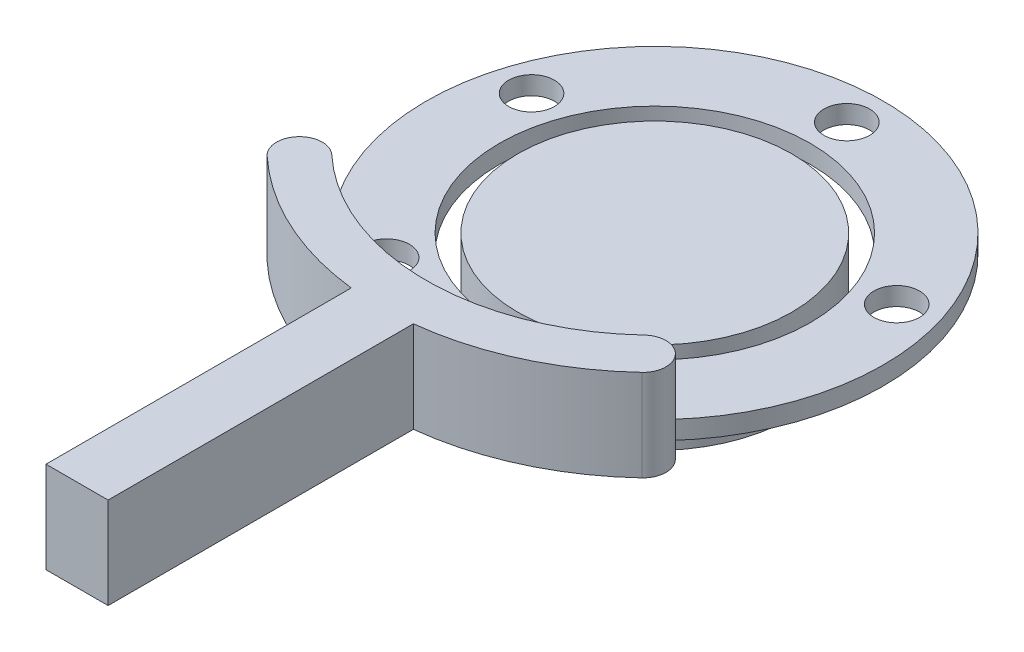
ISO-10303-21;
HEADER;
FILE_DESCRIPTION(('STEP AP214'),'2;1');
FILE_NAME('part.step','',(''),(''),'','','');
FILE_SCHEMA(('AUTOMOTIVE_DESIGN { 1 0 10303 214 1 1 1 1 }'));
ENDSEC;
DATA;
#1=APPLICATION_CONTEXT('core data for automotive mechanical design processes');
#2=APPLICATION_PROTOCOL_DEFINITION('international standard','automotive_design',2000,#1);
#3=PRODUCT_CONTEXT('',#1,'mechanical');
#4=PRODUCT('Part','Part','',(#3));
#5=PRODUCT_RELATED_PRODUCT_CATEGORY('part','',(#4));
#6=PRODUCT_DEFINITION_FORMATION('','',#4);
#7=PRODUCT_DEFINITION_CONTEXT('part definition',#1,'design');
#8=PRODUCT_DEFINITION('design','',#6,#7);
#9=PRODUCT_DEFINITION_SHAPE('','',#8);
#10=(LENGTH_UNIT() NAMED_UNIT(*) SI_UNIT(.MILLI.,.METRE.));
#11=(NAMED_UNIT(*) PLANE_ANGLE_UNIT() SI_UNIT($,.RADIAN.));
#12=(NAMED_UNIT(*) SI_UNIT($,.STERADIAN.) SOLID_ANGLE_UNIT());
#13=UNCERTAINTY_MEASURE_WITH_UNIT(LENGTH_MEASURE(1.E-05),#10,'distance_accuracy_value','');
#14=(GEOMETRIC_REPRESENTATION_CONTEXT(3) GLOBAL_UNCERTAINTY_ASSIGNED_CONTEXT((#13)) GLOBAL_UNIT_ASSIGNED_CONTEXT((#10,
#11,#12)) REPRESENTATION_CONTEXT('',''));
#15=CARTESIAN_POINT('',(0.,0.,0.));
#16=DIRECTION('',(0.,0.,1.));
#17=DIRECTION('',(1.,0.,0.));
#18=AXIS2_PLACEMENT_3D('',#15,#16,#17);
#19=CARTESIAN_POINT('',(0.,50.,0.));
#20=DIRECTION('',(0.,-1.,0.));
#21=DIRECTION('',(0.,0.,-1.));
#22=AXIS2_PLACEMENT_3D('',#19,#20,#21);
#23=CYLINDRICAL_SURFACE('',#22,125.);
#24=CARTESIAN_POINT('',(0.,10.,0.));
#25=DIRECTION('',(0.,1.,0.));
#26=DIRECTION('',(0.,0.,1.));
#27=AXIS2_PLACEMENT_3D('',#24,#25,#26);
#28=CIRCLE('',#27,125.);
#29=CARTESIAN_POINT('',(-85.4248979414119,10.,91.2556124942426));
#30=VERTEX_POINT('',#29);
#31=CARTESIAN_POINT('',(85.4248979414119,10.,91.2556124942426));
#32=VERTEX_POINT('',#31);
#33=EDGE_CURVE('E58',#30,#32,#28,.T.);
#34=ORIENTED_EDGE('',*,*,#33,.F.);
#35=DIRECTION('',(0.,-1.,0.));
#36=VECTOR('',#35,1.);
#37=CARTESIAN_POINT('',(-85.4248979414119,50.,91.2556124942426));
#38=LINE('',#37,#36);
#39=CARTESIAN_POINT('',(-85.4248979414119,50.,91.2556124942426));
#40=VERTEX_POINT('',#39);
#41=EDGE_CURVE('E138',#40,#30,#38,.T.);
#42=ORIENTED_EDGE('',*,*,#41,.F.);
#43=CARTESIAN_POINT('',(0.,50.,0.));
#44=DIRECTION('',(0.,-1.,0.));
#45=DIRECTION('',(0.,0.,1.));
#46=AXIS2_PLACEMENT_3D('',#43,#44,#45);
#47=CIRCLE('',#46,125.);
#48=CARTESIAN_POINT('',(85.4248979414119,50.,91.2556124942426));
#49=VERTEX_POINT('',#48);
#50=EDGE_CURVE('E125',#49,#40,#47,.T.);
#51=ORIENTED_EDGE('',*,*,#50,.F.);
#52=DIRECTION('',(0.,-1.,0.));
#53=VECTOR('',#52,1.);
#54=CARTESIAN_POINT('',(85.4248979414119,50.,91.2556124942426));
#55=LINE('',#54,#53);
#56=EDGE_CURVE('E133',#49,#32,#55,.T.);
#57=ORIENTED_EDGE('',*,*,#56,.T.);
#58=EDGE_LOOP('',(#34,#42,#51,#57));
#59=FACE_BOUND('',#58,.T.);
#60=ADVANCED_FACE('F43',(#59),#23,.F.);
#61=CARTESIAN_POINT('',(0.,50.,0.));
#62=DIRECTION('',(0.,-1.,0.));
#63=DIRECTION('',(0.,0.,-1.));
#64=AXIS2_PLACEMENT_3D('',#61,#62,#63);
#65=CYLINDRICAL_SURFACE('',#64,150.);
#66=CARTESIAN_POINT('',(0.,0.,0.));
#67=DIRECTION('',(0.,1.,0.));
#68=DIRECTION('',(0.,0.,1.));
#69=AXIS2_PLACEMENT_3D('',#66,#67,#68);
#70=CIRCLE('',#69,150.);
#71=CARTESIAN_POINT('',(-102.509877529694,0.,109.506734993091));
#72=VERTEX_POINT('',#71);
#73=CARTESIAN_POINT('',(-16.9845475952056,0.,149.035315086681));
#74=VERTEX_POINT('',#73);
#75=EDGE_CURVE('E145',#72,#74,#70,.T.);
#76=ORIENTED_EDGE('',*,*,#75,.T.);
#77=DIRECTION('',(0.,-1.,0.));
#78=VECTOR('',#77,1.);
#79=CARTESIAN_POINT('',(-16.9845475952056,50.,149.035315086681));
#80=LINE('',#79,#78);
#81=CARTESIAN_POINT('',(-16.9845475952056,50.,149.035315086681));
#82=VERTEX_POINT('',#81);
#83=EDGE_CURVE('E12',#82,#74,#80,.T.);
#84=ORIENTED_EDGE('',*,*,#83,.F.);
#85=CARTESIAN_POINT('',(0.,50.,0.));
#86=DIRECTION('',(0.,1.,0.));
#87=DIRECTION('',(0.,0.,1.));
#88=AXIS2_PLACEMENT_3D('',#85,#86,#87);
#89=CIRCLE('',#88,150.);
#90=CARTESIAN_POINT('',(-102.509877529694,50.,109.506734993091));
#91=VERTEX_POINT('',#90);
#92=EDGE_CURVE('E160',#91,#82,#89,.T.);
#93=ORIENTED_EDGE('',*,*,#92,.F.);
#94=DIRECTION('',(0.,-1.,0.));
#95=VECTOR('',#94,1.);
#96=CARTESIAN_POINT('',(-102.509877529694,50.,109.506734993091));
#97=LINE('',#96,#95);
#98=EDGE_CURVE('E141',#91,#72,#97,.T.);
#99=ORIENTED_EDGE('',*,*,#98,.T.);
#100=EDGE_LOOP('',(#76,#84,#93,#99));
#101=FACE_BOUND('',#100,.T.);
#102=ADVANCED_FACE('F45',(#101),#65,.T.);
#103=CARTESIAN_POINT('',(-16.9845475952056,50.,315.975008697733));
#104=DIRECTION('',(1.,0.,0.));
#105=DIRECTION('',(0.,0.,-1.));
#106=AXIS2_PLACEMENT_3D('',#103,#104,#105);
#107=PLANE('',#106);
#108=DIRECTION('',(0.,0.,1.));
#109=VECTOR('',#108,1.);
#110=CARTESIAN_POINT('',(-16.9845475952056,0.,315.975008697733));
#111=LINE('',#110,#109);
#112=CARTESIAN_POINT('',(-16.9845475952056,0.,315.975008697733));
#113=VERTEX_POINT('',#112);
#114=EDGE_CURVE('E148',#74,#113,#111,.T.);
#115=ORIENTED_EDGE('',*,*,#114,.T.);
#116=DIRECTION('',(0.,-1.,0.));
#117=VECTOR('',#116,1.);
#118=CARTESIAN_POINT('',(-16.9845475952056,50.,315.975008697733));
#119=LINE('',#118,#117);
#120=CARTESIAN_POINT('',(-16.9845475952056,50.,315.975008697733));
#121=VERTEX_POINT('',#120);
#122=EDGE_CURVE('E51',#121,#113,#119,.T.);
#123=ORIENTED_EDGE('',*,*,#122,.F.);
#124=DIRECTION('',(0.,0.,1.));
#125=VECTOR('',#124,1.);
#126=CARTESIAN_POINT('',(-16.9845475952056,50.,315.975008697733));
#127=LINE('',#126,#125);
#128=EDGE_CURVE('E107',#82,#121,#127,.T.);
#129=ORIENTED_EDGE('',*,*,#128,.F.);
#130=ORIENTED_EDGE('',*,*,#83,.T.);
#131=EDGE_LOOP('',(#115,#123,#129,#130));
#132=FACE_BOUND('',#131,.T.);
#133=ADVANCED_FACE('F284',(#132),#107,.F.);
#134=CARTESIAN_POINT('',(16.9845475952056,50.,315.975008697733));
#135=DIRECTION('',(0.,0.,-1.));
#136=DIRECTION('',(-1.,0.,0.));
#137=AXIS2_PLACEMENT_3D('',#134,#135,#136);
#138=PLANE('',#137);
#139=DIRECTION('',(1.,0.,0.));
#140=VECTOR('',#139,1.);
#141=CARTESIAN_POINT('',(16.9845475952056,0.,315.975008697733));
#142=LINE('',#141,#140);
#143=CARTESIAN_POINT('',(16.9845475952056,0.,315.975008697733));
#144=VERTEX_POINT('',#143);
#145=EDGE_CURVE('E151',#113,#144,#142,.T.);
#146=ORIENTED_EDGE('',*,*,#145,.T.);
#147=DIRECTION('',(0.,-1.,0.));
#148=VECTOR('',#147,1.);
#149=CARTESIAN_POINT('',(16.9845475952056,50.,315.975008697733));
#150=LINE('',#149,#148);
#151=CARTESIAN_POINT('',(16.9845475952056,50.,315.975008697733));
#152=VERTEX_POINT('',#151);
#153=EDGE_CURVE('E167',#152,#144,#150,.T.);
#154=ORIENTED_EDGE('',*,*,#153,.F.);
#155=DIRECTION('',(1.,0.,0.));
#156=VECTOR('',#155,1.);
#157=CARTESIAN_POINT('',(16.9845475952056,50.,315.975008697733));
#158=LINE('',#157,#156);
#159=EDGE_CURVE('E175',#121,#152,#158,.T.);
#160=ORIENTED_EDGE('',*,*,#159,.F.);
#161=ORIENTED_EDGE('',*,*,#122,.T.);
#162=EDGE_LOOP('',(#146,#154,#160,#161));
#163=FACE_BOUND('',#162,.T.);
#164=ADVANCED_FACE('F173',(#163),#138,.F.);
#165=CARTESIAN_POINT('',(16.9845475952056,50.,315.975008697733));
#166=DIRECTION('',(-1.,0.,0.));
#167=DIRECTION('',(0.,0.,1.));
#168=AXIS2_PLACEMENT_3D('',#165,#166,#167);
#169=PLANE('',#168);
#170=DIRECTION('',(0.,0.,-1.));
#171=VECTOR('',#170,1.);
#172=CARTESIAN_POINT('',(16.9845475952056,0.,315.975008697733));
#173=LINE('',#172,#171);
#174=CARTESIAN_POINT('',(16.9845475952056,0.,149.035315086681));
#175=VERTEX_POINT('',#174);
#176=EDGE_CURVE('E153',#144,#175,#173,.T.);
#177=ORIENTED_EDGE('',*,*,#176,.T.);
#178=DIRECTION('',(0.,-1.,0.));
#179=VECTOR('',#178,1.);
#180=CARTESIAN_POINT('',(16.9845475952056,50.,149.035315086681));
#181=LINE('',#180,#179);
#182=CARTESIAN_POINT('',(16.9845475952056,50.,149.035315086681));
#183=VERTEX_POINT('',#182);
#184=EDGE_CURVE('E164',#183,#175,#181,.T.);
#185=ORIENTED_EDGE('',*,*,#184,.F.);
#186=DIRECTION('',(0.,0.,-1.));
#187=VECTOR('',#186,1.);
#188=CARTESIAN_POINT('',(16.9845475952056,50.,315.975008697733));
#189=LINE('',#188,#187);
#190=EDGE_CURVE('E189',#152,#183,#189,.T.);
#191=ORIENTED_EDGE('',*,*,#190,.F.);
#192=ORIENTED_EDGE('',*,*,#153,.T.);
#193=EDGE_LOOP('',(#177,#185,#191,#192));
#194=FACE_BOUND('',#193,.T.);
#195=ADVANCED_FACE('F185',(#194),#169,.F.);
#196=CARTESIAN_POINT('',(0.,50.,0.));
#197=DIRECTION('',(0.,-1.,0.));
#198=DIRECTION('',(0.,0.,-1.));
#199=AXIS2_PLACEMENT_3D('',#196,#197,#198);
#200=CYLINDRICAL_SURFACE('',#199,150.);
#201=CARTESIAN_POINT('',(0.,0.,0.));
#202=DIRECTION('',(0.,1.,0.));
#203=DIRECTION('',(0.,0.,1.));
#204=AXIS2_PLACEMENT_3D('',#201,#202,#203);
#205=CIRCLE('',#204,150.);
#206=CARTESIAN_POINT('',(102.509877529694,0.,109.506734993091));
#207=VERTEX_POINT('',#206);
#208=EDGE_CURVE('E155',#175,#207,#205,.T.);
#209=ORIENTED_EDGE('',*,*,#208,.T.);
#210=DIRECTION('',(0.,-1.,0.));
#211=VECTOR('',#210,1.);
#212=CARTESIAN_POINT('',(102.509877529694,50.,109.506734993091));
#213=LINE('',#212,#211);
#214=CARTESIAN_POINT('',(102.509877529694,50.,109.506734993091));
#215=VERTEX_POINT('',#214);
#216=EDGE_CURVE('E137',#215,#207,#213,.T.);
#217=ORIENTED_EDGE('',*,*,#216,.F.);
#218=CARTESIAN_POINT('',(0.,50.,0.));
#219=DIRECTION('',(0.,1.,0.));
#220=DIRECTION('',(0.,0.,1.));
#221=AXIS2_PLACEMENT_3D('',#218,#219,#220);
#222=CIRCLE('',#221,150.);
#223=EDGE_CURVE('E127',#183,#215,#222,.T.);
#224=ORIENTED_EDGE('',*,*,#223,.F.);
#225=ORIENTED_EDGE('',*,*,#184,.T.);
#226=EDGE_LOOP('',(#209,#217,#224,#225));
#227=FACE_BOUND('',#226,.T.);
#228=ADVANCED_FACE('F188',(#227),#200,.T.);
#229=CARTESIAN_POINT('',(93.967387735553,50.,100.381173743667));
#230=DIRECTION('',(0.,-1.,0.));
#231=DIRECTION('',(0.,0.,-1.));
#232=AXIS2_PLACEMENT_3D('',#229,#230,#231);
#233=CYLINDRICAL_SURFACE('',#232,12.5);
#234=CARTESIAN_POINT('',(93.967387735553,0.,100.381173743667));
#235=DIRECTION('',(0.,1.,0.));
#236=DIRECTION('',(0.,0.,-1.));
#237=AXIS2_PLACEMENT_3D('',#234,#235,#236);
#238=CIRCLE('',#237,12.5);
#239=CARTESIAN_POINT('',(85.4248979414119,0.,91.2556124942426));
#240=VERTEX_POINT('',#239);
#241=EDGE_CURVE('E157',#207,#240,#238,.T.);
#242=ORIENTED_EDGE('',*,*,#241,.T.);
#243=EDGE_CURVE('E136',#32,#240,#55,.T.);
#244=ORIENTED_EDGE('',*,*,#243,.F.);
#245=ORIENTED_EDGE('',*,*,#56,.F.);
#246=CARTESIAN_POINT('',(93.967387735553,50.,100.381173743667));
#247=DIRECTION('',(0.,1.,0.));
#248=DIRECTION('',(0.,0.,-1.));
#249=AXIS2_PLACEMENT_3D('',#246,#247,#248);
#250=CIRCLE('',#249,12.5);
#251=EDGE_CURVE('E121',#215,#49,#250,.T.);
#252=ORIENTED_EDGE('',*,*,#251,.F.);
#253=ORIENTED_EDGE('',*,*,#216,.T.);
#254=EDGE_LOOP('',(#242,#244,#245,#252,#253));
#255=FACE_BOUND('',#254,.T.);
#256=ADVANCED_FACE('F134',(#255),#233,.T.);
#257=CARTESIAN_POINT('',(-93.967387735553,50.,100.381173743667));
#258=DIRECTION('',(0.,-1.,0.));
#259=DIRECTION('',(0.,0.,-1.));
#260=AXIS2_PLACEMENT_3D('',#257,#258,#259);
#261=CYLINDRICAL_SURFACE('',#260,12.5);
#262=CARTESIAN_POINT('',(-93.967387735553,0.,100.381173743667));
#263=DIRECTION('',(0.,1.,0.));
#264=DIRECTION('',(0.,0.,1.));
#265=AXIS2_PLACEMENT_3D('',#262,#263,#264);
#266=CIRCLE('',#265,12.5);
#267=CARTESIAN_POINT('',(-85.4248979414119,0.,91.2556124942426));
#268=VERTEX_POINT('',#267);
#269=EDGE_CURVE('E99',#268,#72,#266,.T.);
#270=ORIENTED_EDGE('',*,*,#269,.T.);
#271=ORIENTED_EDGE('',*,*,#98,.F.);
#272=CARTESIAN_POINT('',(-93.967387735553,50.,100.381173743667));
#273=DIRECTION('',(0.,1.,0.));
#274=DIRECTION('',(0.,0.,1.));
#275=AXIS2_PLACEMENT_3D('',#272,#273,#274);
#276=CIRCLE('',#275,12.5);
#277=EDGE_CURVE('E67',#40,#91,#276,.T.);
#278=ORIENTED_EDGE('',*,*,#277,.F.);
#279=ORIENTED_EDGE('',*,*,#41,.T.);
#280=EDGE_CURVE('E149',#30,#268,#38,.T.);
#281=ORIENTED_EDGE('',*,*,#280,.T.);
#282=EDGE_LOOP('',(#270,#271,#278,#279,#281));
#283=FACE_BOUND('',#282,.T.);
#284=ADVANCED_FACE('F275',(#283),#261,.T.);
#285=CARTESIAN_POINT('',(0.,50.,0.));
#286=DIRECTION('',(0.,1.,0.));
#287=DIRECTION('',(0.,0.,1.));
#288=AXIS2_PLACEMENT_3D('',#285,#286,#287);
#289=PLANE('',#288);
#290=ORIENTED_EDGE('',*,*,#92,.T.);
#291=ORIENTED_EDGE('',*,*,#128,.T.);
#292=ORIENTED_EDGE('',*,*,#159,.T.);
#293=ORIENTED_EDGE('',*,*,#190,.T.);
#294=ORIENTED_EDGE('',*,*,#223,.T.);
#295=ORIENTED_EDGE('',*,*,#251,.T.);
#296=ORIENTED_EDGE('',*,*,#50,.T.);
#297=ORIENTED_EDGE('',*,*,#277,.T.);
#298=EDGE_LOOP('',(#290,#291,#292,#293,#294,#295,#296,#297));
#299=FACE_BOUND('',#298,.T.);
#300=ADVANCED_FACE('F123',(#299),#289,.T.);
#301=CARTESIAN_POINT('',(0.,0.,0.));
#302=DIRECTION('',(0.,1.,0.));
#303=DIRECTION('',(0.,0.,1.));
#304=AXIS2_PLACEMENT_3D('',#301,#302,#303);
#305=PLANE('',#304);
#306=ORIENTED_EDGE('',*,*,#75,.F.);
#307=ORIENTED_EDGE('',*,*,#269,.F.);
#308=CARTESIAN_POINT('',(0.,0.,0.));
#309=DIRECTION('',(0.,1.,0.));
#310=DIRECTION('',(0.,0.,1.));
#311=AXIS2_PLACEMENT_3D('',#308,#309,#310);
#312=CIRCLE('',#311,125.);
#313=EDGE_CURVE('E195',#240,#268,#312,.T.);
#314=ORIENTED_EDGE('',*,*,#313,.F.);
#315=ORIENTED_EDGE('',*,*,#241,.F.);
#316=ORIENTED_EDGE('',*,*,#208,.F.);
#317=ORIENTED_EDGE('',*,*,#176,.F.);
#318=ORIENTED_EDGE('',*,*,#145,.F.);
#319=ORIENTED_EDGE('',*,*,#114,.F.);
#320=EDGE_LOOP('',(#306,#307,#314,#315,#316,#317,#318,#319));
#321=FACE_BOUND('',#320,.T.);
#322=CARTESIAN_POINT('',(-99.8609342109912,0.,-32.4467844093692));
#323=DIRECTION('',(0.,1.,0.));
#324=DIRECTION('',(0.951056516295155,0.,0.309016994374945));
#325=AXIS2_PLACEMENT_3D('',#322,#323,#324);
#326=CIRCLE('',#325,12.5);
#327=CARTESIAN_POINT('',(-87.9727277573018,0.,-28.5840719796824));
#328=VERTEX_POINT('',#327);
#329=EDGE_CURVE('E211',#328,#328,#326,.T.);
#330=ORIENTED_EDGE('',*,*,#329,.T.);
#331=EDGE_LOOP('',(#330));
#332=FACE_BOUND('',#331,.T.);
#333=CARTESIAN_POINT('',(-61.7174514907092,0.,84.9467844093698));
#334=DIRECTION('',(0.,1.,0.));
#335=DIRECTION('',(0.587785252292469,0.,-0.809016994374951));
#336=AXIS2_PLACEMENT_3D('',#333,#334,#335);
#337=CIRCLE('',#336,12.5);
#338=CARTESIAN_POINT('',(-54.3701358370533,0.,74.8340719796829));
#339=VERTEX_POINT('',#338);
#340=EDGE_CURVE('E229',#339,#339,#337,.T.);
#341=ORIENTED_EDGE('',*,*,#340,.T.);
#342=EDGE_LOOP('',(#341));
#343=FACE_BOUND('',#342,.T.);
#344=CARTESIAN_POINT('',(61.7174514907104,0.,84.9467844093689));
#345=DIRECTION('',(0.,1.,0.));
#346=DIRECTION('',(-0.58778525229248,0.,-0.809016994374942));
#347=AXIS2_PLACEMENT_3D('',#344,#345,#346);
#348=CIRCLE('',#347,12.5);
#349=CARTESIAN_POINT('',(54.3701358370544,0.,74.8340719796821));
#350=VERTEX_POINT('',#349);
#351=EDGE_CURVE('E223',#350,#350,#348,.T.);
#352=ORIENTED_EDGE('',*,*,#351,.T.);
#353=EDGE_LOOP('',(#352));
#354=FACE_BOUND('',#353,.T.);
#355=CARTESIAN_POINT('',(99.8609342109907,0.,-32.4467844093706));
#356=DIRECTION('',(0.,1.,0.));
#357=DIRECTION('',(-0.95105651629515,0.,0.309016994374958));
#358=AXIS2_PLACEMENT_3D('',#355,#356,#357);
#359=CIRCLE('',#358,12.5);
#360=CARTESIAN_POINT('',(87.9727277573014,0.,-28.5840719796836));
#361=VERTEX_POINT('',#360);
#362=EDGE_CURVE('E217',#361,#361,#359,.T.);
#363=ORIENTED_EDGE('',*,*,#362,.T.);
#364=EDGE_LOOP('',(#363));
#365=FACE_BOUND('',#364,.T.);
#366=CARTESIAN_POINT('',(0.,0.,-105.));
#367=DIRECTION('',(0.,1.,0.));
#368=DIRECTION('',(0.,0.,1.));
#369=AXIS2_PLACEMENT_3D('',#366,#367,#368);
#370=CIRCLE('',#369,12.5);
#371=CARTESIAN_POINT('',(0.,0.,-92.5));
#372=VERTEX_POINT('',#371);
#373=EDGE_CURVE('E205',#372,#372,#370,.T.);
#374=ORIENTED_EDGE('',*,*,#373,.T.);
#375=EDGE_LOOP('',(#374));
#376=FACE_BOUND('',#375,.T.);
#377=CARTESIAN_POINT('',(0.,0.,0.));
#378=DIRECTION('',(0.,1.,0.));
#379=DIRECTION('',(0.,0.,1.));
#380=AXIS2_PLACEMENT_3D('',#377,#378,#379);
#381=CIRCLE('',#380,85.);
#382=CARTESIAN_POINT('',(0.,0.,85.));
#383=VERTEX_POINT('',#382);
#384=EDGE_CURVE('E202',#383,#383,#381,.T.);
#385=ORIENTED_EDGE('',*,*,#384,.T.);
#386=EDGE_LOOP('',(#385));
#387=FACE_BOUND('',#386,.T.);
#388=ADVANCED_FACE('F179',(#321,#332,#343,#354,#365,#376,#387),#305,.F.);
#389=CARTESIAN_POINT('',(0.,10.,0.));
#390=DIRECTION('',(0.,1.,0.));
#391=DIRECTION('',(0.,0.,1.));
#392=AXIS2_PLACEMENT_3D('',#389,#390,#391);
#393=PLANE('',#392);
#394=CARTESIAN_POINT('',(-99.8609342109912,10.,-32.4467844093692));
#395=DIRECTION('',(0.,1.,0.));
#396=DIRECTION('',(0.951056516295155,0.,0.309016994374945));
#397=AXIS2_PLACEMENT_3D('',#394,#395,#396);
#398=CIRCLE('',#397,12.5);
#399=CARTESIAN_POINT('',(-87.9727277573018,10.,-28.5840719796824));
#400=VERTEX_POINT('',#399);
#401=EDGE_CURVE('E232',#400,#400,#398,.T.);
#402=ORIENTED_EDGE('',*,*,#401,.F.);
#403=EDGE_LOOP('',(#402));
#404=FACE_BOUND('',#403,.T.);
#405=CARTESIAN_POINT('',(-61.7174514907092,10.,84.9467844093698));
#406=DIRECTION('',(0.,1.,0.));
#407=DIRECTION('',(0.587785252292469,0.,-0.809016994374951));
#408=AXIS2_PLACEMENT_3D('',#405,#406,#407);
#409=CIRCLE('',#408,12.5);
#410=CARTESIAN_POINT('',(-54.3701358370533,10.,74.8340719796829));
#411=VERTEX_POINT('',#410);
#412=EDGE_CURVE('E226',#411,#411,#409,.T.);
#413=ORIENTED_EDGE('',*,*,#412,.F.);
#414=EDGE_LOOP('',(#413));
#415=FACE_BOUND('',#414,.T.);
#416=CARTESIAN_POINT('',(61.7174514907104,10.,84.9467844093689));
#417=DIRECTION('',(0.,1.,0.));
#418=DIRECTION('',(-0.58778525229248,0.,-0.809016994374942));
#419=AXIS2_PLACEMENT_3D('',#416,#417,#418);
#420=CIRCLE('',#419,12.5);
#421=CARTESIAN_POINT('',(54.3701358370544,10.,74.8340719796821));
#422=VERTEX_POINT('',#421);
#423=EDGE_CURVE('E220',#422,#422,#420,.T.);
#424=ORIENTED_EDGE('',*,*,#423,.F.);
#425=EDGE_LOOP('',(#424));
#426=FACE_BOUND('',#425,.T.);
#427=CARTESIAN_POINT('',(99.8609342109907,10.,-32.4467844093706));
#428=DIRECTION('',(0.,1.,0.));
#429=DIRECTION('',(-0.95105651629515,0.,0.309016994374958));
#430=AXIS2_PLACEMENT_3D('',#427,#428,#429);
#431=CIRCLE('',#430,12.5);
#432=CARTESIAN_POINT('',(87.9727277573014,10.,-28.5840719796836));
#433=VERTEX_POINT('',#432);
#434=EDGE_CURVE('E214',#433,#433,#431,.T.);
#435=ORIENTED_EDGE('',*,*,#434,.F.);
#436=EDGE_LOOP('',(#435));
#437=FACE_BOUND('',#436,.T.);
#438=CARTESIAN_POINT('',(0.,10.,-105.));
#439=DIRECTION('',(0.,1.,0.));
#440=DIRECTION('',(0.,0.,1.));
#441=AXIS2_PLACEMENT_3D('',#438,#439,#440);
#442=CIRCLE('',#441,12.5);
#443=CARTESIAN_POINT('',(0.,10.,-92.5));
#444=VERTEX_POINT('',#443);
#445=EDGE_CURVE('E208',#444,#444,#442,.T.);
#446=ORIENTED_EDGE('',*,*,#445,.F.);
#447=EDGE_LOOP('',(#446));
#448=FACE_BOUND('',#447,.T.);
#449=EDGE_CURVE('E199',#32,#30,#28,.T.);
#450=ORIENTED_EDGE('',*,*,#449,.T.);
#451=ORIENTED_EDGE('',*,*,#33,.T.);
#452=EDGE_LOOP('',(#450,#451));
#453=FACE_BOUND('',#452,.T.);
#454=CARTESIAN_POINT('',(0.,10.,0.));
#455=DIRECTION('',(0.,1.,0.));
#456=DIRECTION('',(0.,0.,1.));
#457=AXIS2_PLACEMENT_3D('',#454,#455,#456);
#458=CIRCLE('',#457,85.);
#459=CARTESIAN_POINT('',(0.,10.,85.));
#460=VERTEX_POINT('',#459);
#461=EDGE_CURVE('E198',#460,#460,#458,.T.);
#462=ORIENTED_EDGE('',*,*,#461,.F.);
#463=EDGE_LOOP('',(#462));
#464=FACE_BOUND('',#463,.T.);
#465=ADVANCED_FACE('F246',(#404,#415,#426,#437,#448,#453,#464),#393,.T.);
#466=CARTESIAN_POINT('',(0.,10.,0.));
#467=DIRECTION('',(0.,-1.,0.));
#468=DIRECTION('',(0.,0.,-1.));
#469=AXIS2_PLACEMENT_3D('',#466,#467,#468);
#470=CYLINDRICAL_SURFACE('',#469,125.);
#471=ORIENTED_EDGE('',*,*,#280,.F.);
#472=ORIENTED_EDGE('',*,*,#449,.F.);
#473=ORIENTED_EDGE('',*,*,#243,.T.);
#474=ORIENTED_EDGE('',*,*,#313,.T.);
#475=EDGE_LOOP('',(#471,#472,#473,#474));
#476=FACE_BOUND('',#475,.T.);
#477=ADVANCED_FACE('F249',(#476),#470,.T.);
#478=CARTESIAN_POINT('',(0.,10.,0.));
#479=DIRECTION('',(0.,-1.,0.));
#480=DIRECTION('',(0.,0.,-1.));
#481=AXIS2_PLACEMENT_3D('',#478,#479,#480);
#482=CYLINDRICAL_SURFACE('',#481,85.);
#483=ORIENTED_EDGE('',*,*,#461,.T.);
#484=EDGE_LOOP('',(#483));
#485=FACE_BOUND('',#484,.T.);
#486=ORIENTED_EDGE('',*,*,#384,.F.);
#487=EDGE_LOOP('',(#486));
#488=FACE_BOUND('',#487,.T.);
#489=ADVANCED_FACE('F263',(#485,#488),#482,.F.);
#490=CARTESIAN_POINT('',(0.,0.,-105.));
#491=DIRECTION('',(0.,1.,0.));
#492=DIRECTION('',(0.,0.,1.));
#493=AXIS2_PLACEMENT_3D('',#490,#491,#492);
#494=CYLINDRICAL_SURFACE('',#493,12.5);
#495=ORIENTED_EDGE('',*,*,#373,.F.);
#496=EDGE_LOOP('',(#495));
#497=FACE_BOUND('',#496,.T.);
#498=ORIENTED_EDGE('',*,*,#445,.T.);
#499=EDGE_LOOP('',(#498));
#500=FACE_BOUND('',#499,.T.);
#501=ADVANCED_FACE('F266',(#497,#500),#494,.F.);
#502=CARTESIAN_POINT('',(99.8609342109907,0.,-32.4467844093706));
#503=DIRECTION('',(0.,1.,0.));
#504=DIRECTION('',(0.,0.,1.));
#505=AXIS2_PLACEMENT_3D('',#502,#503,#504);
#506=CYLINDRICAL_SURFACE('',#505,12.5);
#507=ORIENTED_EDGE('',*,*,#362,.F.);
#508=EDGE_LOOP('',(#507));
#509=FACE_BOUND('',#508,.T.);
#510=ORIENTED_EDGE('',*,*,#434,.T.);
#511=EDGE_LOOP('',(#510));
#512=FACE_BOUND('',#511,.T.);
#513=ADVANCED_FACE('F357',(#509,#512),#506,.F.);
#514=CARTESIAN_POINT('',(61.7174514907104,0.,84.9467844093689));
#515=DIRECTION('',(0.,1.,0.));
#516=DIRECTION('',(0.,0.,1.));
#517=AXIS2_PLACEMENT_3D('',#514,#515,#516);
#518=CYLINDRICAL_SURFACE('',#517,12.5);
#519=ORIENTED_EDGE('',*,*,#351,.F.);
#520=EDGE_LOOP('',(#519));
#521=FACE_BOUND('',#520,.T.);
#522=ORIENTED_EDGE('',*,*,#423,.T.);
#523=EDGE_LOOP('',(#522));
#524=FACE_BOUND('',#523,.T.);
#525=ADVANCED_FACE('F368',(#521,#524),#518,.F.);
#526=CARTESIAN_POINT('',(-61.7174514907092,0.,84.9467844093698));
#527=DIRECTION('',(0.,1.,0.));
#528=DIRECTION('',(0.,0.,1.));
#529=AXIS2_PLACEMENT_3D('',#526,#527,#528);
#530=CYLINDRICAL_SURFACE('',#529,12.5);
#531=ORIENTED_EDGE('',*,*,#340,.F.);
#532=EDGE_LOOP('',(#531));
#533=FACE_BOUND('',#532,.T.);
#534=ORIENTED_EDGE('',*,*,#412,.T.);
#535=EDGE_LOOP('',(#534));
#536=FACE_BOUND('',#535,.T.);
#537=ADVANCED_FACE('F242',(#533,#536),#530,.F.);
#538=CARTESIAN_POINT('',(-99.8609342109912,0.,-32.4467844093692));
#539=DIRECTION('',(0.,1.,0.));
#540=DIRECTION('',(0.,0.,1.));
#541=AXIS2_PLACEMENT_3D('',#538,#539,#540);
#542=CYLINDRICAL_SURFACE('',#541,12.5);
#543=ORIENTED_EDGE('',*,*,#329,.F.);
#544=EDGE_LOOP('',(#543));
#545=FACE_BOUND('',#544,.T.);
#546=ORIENTED_EDGE('',*,*,#401,.T.);
#547=EDGE_LOOP('',(#546));
#548=FACE_BOUND('',#547,.T.);
#549=ADVANCED_FACE('F239',(#545,#548),#542,.F.);
#550=CLOSED_SHELL('',(#60,#102,#133,#164,#195,#228,#256,#284,#300,#388,#465,#477,#489,#501,#513,
#525,#537,#549));
#551=MANIFOLD_SOLID_BREP('B2',#550);
#552=CARTESIAN_POINT('',(0.,10.,0.));
#553=DIRECTION('',(0.,-1.,0.));
#554=DIRECTION('',(0.,0.,-1.));
#555=AXIS2_PLACEMENT_3D('',#552,#553,#554);
#556=CYLINDRICAL_SURFACE('',#555,74.9999999999999);
#557=CARTESIAN_POINT('',(0.,10.,0.));
#558=DIRECTION('',(0.,1.,0.));
#559=DIRECTION('',(0.,0.,1.));
#560=AXIS2_PLACEMENT_3D('',#557,#558,#559);
#561=CIRCLE('',#560,74.9999999999999);
#562=CARTESIAN_POINT('',(0.,10.,74.9999999999999));
#563=VERTEX_POINT('',#562);
#564=EDGE_CURVE('E42',#563,#563,#561,.T.);
#565=ORIENTED_EDGE('',*,*,#564,.F.);
#566=EDGE_LOOP('',(#565));
#567=FACE_BOUND('',#566,.T.);
#568=CARTESIAN_POINT('',(0.,-40.,0.));
#569=DIRECTION('',(0.,1.,0.));
#570=DIRECTION('',(0.,0.,1.));
#571=AXIS2_PLACEMENT_3D('',#568,#569,#570);
#572=CIRCLE('',#571,74.9999999999999);
#573=CARTESIAN_POINT('',(0.,-40.,74.9999999999999));
#574=VERTEX_POINT('',#573);
#575=EDGE_CURVE('E451',#574,#574,#572,.T.);
#576=ORIENTED_EDGE('',*,*,#575,.T.);
#577=EDGE_LOOP('',(#576));
#578=FACE_BOUND('',#577,.T.);
#579=ADVANCED_FACE('F448',(#567,#578),#556,.T.);
#580=CARTESIAN_POINT('',(0.,10.,0.));
#581=DIRECTION('',(0.,1.,0.));
#582=DIRECTION('',(0.,0.,1.));
#583=AXIS2_PLACEMENT_3D('',#580,#581,#582);
#584=PLANE('',#583);
#585=ORIENTED_EDGE('',*,*,#564,.T.);
#586=EDGE_LOOP('',(#585));
#587=FACE_BOUND('',#586,.T.);
#588=ADVANCED_FACE('F463',(#587),#584,.T.);
#589=CARTESIAN_POINT('',(0.,-40.,0.));
#590=DIRECTION('',(0.,1.,0.));
#591=DIRECTION('',(0.,0.,1.));
#592=AXIS2_PLACEMENT_3D('',#589,#590,#591);
#593=PLANE('',#592);
#594=ORIENTED_EDGE('',*,*,#575,.F.);
#595=EDGE_LOOP('',(#594));
#596=FACE_BOUND('',#595,.T.);
#597=ADVANCED_FACE('F461',(#596),#593,.F.);
#598=CLOSED_SHELL('',(#579,#588,#597));
#599=MANIFOLD_SOLID_BREP('B6',#598);
#600=ADVANCED_BREP_SHAPE_REPRESENTATION('',(#18,#551,#599),#14);
#601=SHAPE_DEFINITION_REPRESENTATION(#9,#600);
ENDSEC;
END-ISO-10303-21;
